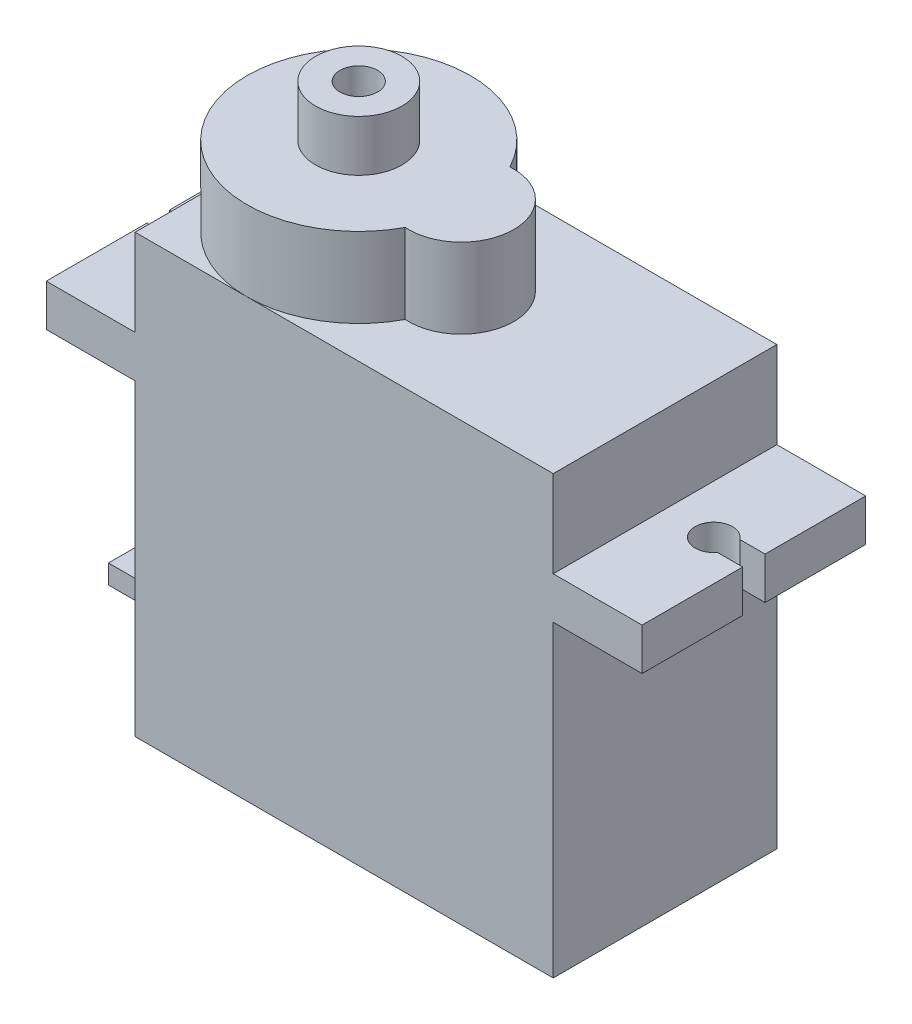
ISO-10303-21;
HEADER;
FILE_DESCRIPTION(('STEP AP214'),'2;1');
FILE_NAME('part.step','',(''),(''),'','','');
FILE_SCHEMA(('AUTOMOTIVE_DESIGN { 1 0 10303 214 1 1 1 1 }'));
ENDSEC;
DATA;
#1=APPLICATION_CONTEXT('core data for automotive mechanical design processes');
#2=APPLICATION_PROTOCOL_DEFINITION('international standard','automotive_design',2000,#1);
#3=PRODUCT_CONTEXT('',#1,'mechanical');
#4=PRODUCT('Part','Part','',(#3));
#5=PRODUCT_RELATED_PRODUCT_CATEGORY('part','',(#4));
#6=PRODUCT_DEFINITION_FORMATION('','',#4);
#7=PRODUCT_DEFINITION_CONTEXT('part definition',#1,'design');
#8=PRODUCT_DEFINITION('design','',#6,#7);
#9=PRODUCT_DEFINITION_SHAPE('','',#8);
#10=(LENGTH_UNIT() NAMED_UNIT(*) SI_UNIT(.MILLI.,.METRE.));
#11=(NAMED_UNIT(*) PLANE_ANGLE_UNIT() SI_UNIT($,.RADIAN.));
#12=(NAMED_UNIT(*) SI_UNIT($,.STERADIAN.) SOLID_ANGLE_UNIT());
#13=UNCERTAINTY_MEASURE_WITH_UNIT(LENGTH_MEASURE(1.E-05),#10,'distance_accuracy_value','');
#14=(GEOMETRIC_REPRESENTATION_CONTEXT(3) GLOBAL_UNCERTAINTY_ASSIGNED_CONTEXT((#13)) GLOBAL_UNIT_ASSIGNED_CONTEXT((#10,
#11,#12)) REPRESENTATION_CONTEXT('',''));
#15=CARTESIAN_POINT('',(0.,0.,0.));
#16=DIRECTION('',(0.,0.,1.));
#17=DIRECTION('',(1.,0.,0.));
#18=AXIS2_PLACEMENT_3D('',#15,#16,#17);
#19=CARTESIAN_POINT('',(0.,23.79,0.));
#20=DIRECTION('',(1.,0.,0.));
#21=DIRECTION('',(0.,0.,-1.));
#22=AXIS2_PLACEMENT_3D('',#19,#20,#21);
#23=PLANE('',#22);
#24=DIRECTION('',(0.,-1.,0.));
#25=VECTOR('',#24,1.);
#26=CARTESIAN_POINT('',(0.,23.79,0.));
#27=LINE('',#26,#25);
#28=CARTESIAN_POINT('',(0.,16.7796,0.));
#29=VERTEX_POINT('',#28);
#30=CARTESIAN_POINT('',(0.,0.,0.));
#31=VERTEX_POINT('',#30);
#32=EDGE_CURVE('E408',#29,#31,#27,.T.);
#33=ORIENTED_EDGE('',*,*,#32,.F.);
#34=DIRECTION('',(0.,0.,-1.));
#35=VECTOR('',#34,1.);
#36=CARTESIAN_POINT('',(0.,16.7796,0.));
#37=LINE('',#36,#35);
#38=CARTESIAN_POINT('',(0.,16.7796,-12.18));
#39=VERTEX_POINT('',#38);
#40=EDGE_CURVE('E370',#29,#39,#37,.T.);
#41=ORIENTED_EDGE('',*,*,#40,.T.);
#42=DIRECTION('',(0.,-1.,0.));
#43=VECTOR('',#42,1.);
#44=CARTESIAN_POINT('',(0.,23.79,-12.18));
#45=LINE('',#44,#43);
#46=CARTESIAN_POINT('',(0.,0.,-12.18));
#47=VERTEX_POINT('',#46);
#48=EDGE_CURVE('E387',#39,#47,#45,.T.);
#49=ORIENTED_EDGE('',*,*,#48,.T.);
#50=DIRECTION('',(0.,0.,1.));
#51=VECTOR('',#50,1.);
#52=CARTESIAN_POINT('',(0.,0.,0.));
#53=LINE('',#52,#51);
#54=EDGE_CURVE('E372',#47,#31,#53,.T.);
#55=ORIENTED_EDGE('',*,*,#54,.T.);
#56=EDGE_LOOP('',(#33,#41,#49,#55));
#57=FACE_BOUND('',#56,.T.);
#58=DIRECTION('',(0.,-1.,0.));
#59=VECTOR('',#58,1.);
#60=CARTESIAN_POINT('',(0.,1.78,-7.5378));
#61=LINE('',#60,#59);
#62=CARTESIAN_POINT('',(0.,2.8214,-7.5378));
#63=VERTEX_POINT('',#62);
#64=CARTESIAN_POINT('',(0.,1.78,-7.5378));
#65=VERTEX_POINT('',#64);
#66=EDGE_CURVE('E228',#63,#65,#61,.T.);
#67=ORIENTED_EDGE('',*,*,#66,.F.);
#68=DIRECTION('',(0.,0.,-1.));
#69=VECTOR('',#68,1.);
#70=CARTESIAN_POINT('',(0.,2.8214,-7.5378));
#71=LINE('',#70,#69);
#72=CARTESIAN_POINT('',(0.,2.8214,-4.6422));
#73=VERTEX_POINT('',#72);
#74=EDGE_CURVE('E240',#73,#63,#71,.T.);
#75=ORIENTED_EDGE('',*,*,#74,.F.);
#76=DIRECTION('',(0.,1.,0.));
#77=VECTOR('',#76,1.);
#78=CARTESIAN_POINT('',(0.,1.78,-4.6422));
#79=LINE('',#78,#77);
#80=CARTESIAN_POINT('',(0.,1.78,-4.6422));
#81=VERTEX_POINT('',#80);
#82=EDGE_CURVE('E57',#81,#73,#79,.T.);
#83=ORIENTED_EDGE('',*,*,#82,.F.);
#84=DIRECTION('',(0.,0.,1.));
#85=VECTOR('',#84,1.);
#86=CARTESIAN_POINT('',(0.,1.78,-7.5378));
#87=LINE('',#86,#85);
#88=EDGE_CURVE('E52',#65,#81,#87,.T.);
#89=ORIENTED_EDGE('',*,*,#88,.F.);
#90=EDGE_LOOP('',(#67,#75,#83,#89));
#91=FACE_BOUND('',#90,.T.);
#92=ADVANCED_FACE('F35',(#57,#91),#23,.F.);
#93=CARTESIAN_POINT('',(0.,23.79,0.));
#94=DIRECTION('',(0.,-1.,0.));
#95=DIRECTION('',(0.,0.,-1.));
#96=AXIS2_PLACEMENT_3D('',#93,#94,#95);
#97=PLANE('',#96);
#98=CARTESIAN_POINT('',(11.6713,23.79,-6.09));
#99=DIRECTION('',(0.,1.,0.));
#100=DIRECTION('',(0.,0.,1.));
#101=AXIS2_PLACEMENT_3D('',#98,#99,#100);
#102=CIRCLE('',#101,2.8575);
#103=CARTESIAN_POINT('',(11.471694537115,23.79,-3.23948006335924));
#104=VERTEX_POINT('',#103);
#105=CARTESIAN_POINT('',(11.471694537115,23.79,-8.94051993664077));
#106=VERTEX_POINT('',#105);
#107=EDGE_CURVE('E265',#104,#106,#102,.T.);
#108=ORIENTED_EDGE('',*,*,#107,.F.);
#109=CARTESIAN_POINT('',(6.09,23.79,-6.09));
#110=DIRECTION('',(0.,1.,0.));
#111=DIRECTION('',(0.,0.,1.));
#112=AXIS2_PLACEMENT_3D('',#109,#110,#111);
#113=CIRCLE('',#112,6.09);
#114=CARTESIAN_POINT('',(6.09,23.79,0.));
#115=VERTEX_POINT('',#114);
#116=EDGE_CURVE('E277',#115,#104,#113,.T.);
#117=ORIENTED_EDGE('',*,*,#116,.F.);
#118=DIRECTION('',(1.,0.,0.));
#119=VECTOR('',#118,1.);
#120=CARTESIAN_POINT('',(0.,23.79,0.));
#121=LINE('',#120,#119);
#122=CARTESIAN_POINT('',(22.7711,23.79,0.));
#123=VERTEX_POINT('',#122);
#124=EDGE_CURVE('E376',#115,#123,#121,.T.);
#125=ORIENTED_EDGE('',*,*,#124,.T.);
#126=DIRECTION('',(0.,0.,-1.));
#127=VECTOR('',#126,1.);
#128=CARTESIAN_POINT('',(22.7711,23.79,0.));
#129=LINE('',#128,#127);
#130=CARTESIAN_POINT('',(22.7711,23.79,-12.18));
#131=VERTEX_POINT('',#130);
#132=EDGE_CURVE('E381',#123,#131,#129,.T.);
#133=ORIENTED_EDGE('',*,*,#132,.T.);
#134=DIRECTION('',(-1.,0.,0.));
#135=VECTOR('',#134,1.);
#136=CARTESIAN_POINT('',(0.,23.79,-12.18));
#137=LINE('',#136,#135);
#138=CARTESIAN_POINT('',(6.09,23.79,-12.18));
#139=VERTEX_POINT('',#138);
#140=EDGE_CURVE('E384',#131,#139,#137,.T.);
#141=ORIENTED_EDGE('',*,*,#140,.T.);
#142=EDGE_CURVE('E45',#106,#139,#113,.T.);
#143=ORIENTED_EDGE('',*,*,#142,.F.);
#144=EDGE_LOOP('',(#108,#117,#125,#133,#141,#143));
#145=FACE_BOUND('',#144,.T.);
#146=ADVANCED_FACE('F462',(#145),#97,.F.);
#147=CARTESIAN_POINT('',(0.,23.79,-6.09));
#148=VERTEX_POINT('',#147);
#149=EDGE_CURVE('E11',#139,#148,#113,.T.);
#150=ORIENTED_EDGE('',*,*,#149,.F.);
#151=CARTESIAN_POINT('',(0.,23.79,-12.18));
#152=VERTEX_POINT('',#151);
#153=EDGE_CURVE('E383',#139,#152,#137,.T.);
#154=ORIENTED_EDGE('',*,*,#153,.T.);
#155=DIRECTION('',(0.,0.,1.));
#156=VECTOR('',#155,1.);
#157=CARTESIAN_POINT('',(0.,23.79,0.));
#158=LINE('',#157,#156);
#159=EDGE_CURVE('E373',#152,#148,#158,.T.);
#160=ORIENTED_EDGE('',*,*,#159,.T.);
#161=EDGE_LOOP('',(#150,#154,#160));
#162=FACE_BOUND('',#161,.T.);
#163=ADVANCED_FACE('F439',(#162),#97,.F.);
#164=CARTESIAN_POINT('',(27.6098,16.7796,0.));
#165=DIRECTION('',(1.,0.,0.));
#166=DIRECTION('',(0.,0.,-1.));
#167=AXIS2_PLACEMENT_3D('',#164,#165,#166);
#168=PLANE('',#167);
#169=DIRECTION('',(0.,1.,0.));
#170=VECTOR('',#169,1.);
#171=CARTESIAN_POINT('',(27.6098,0.,-6.6996));
#172=LINE('',#171,#170);
#173=CARTESIAN_POINT('',(27.6098,16.7796,-6.6996));
#174=VERTEX_POINT('',#173);
#175=CARTESIAN_POINT('',(27.6098,19.0656,-6.6996));
#176=VERTEX_POINT('',#175);
#177=EDGE_CURVE('E295',#174,#176,#172,.T.);
#178=ORIENTED_EDGE('',*,*,#177,.F.);
#179=DIRECTION('',(0.,0.,-1.));
#180=VECTOR('',#179,1.);
#181=CARTESIAN_POINT('',(27.6098,16.7796,0.));
#182=LINE('',#181,#180);
#183=CARTESIAN_POINT('',(27.6098,16.7796,-12.18));
#184=VERTEX_POINT('',#183);
#185=EDGE_CURVE('E327',#174,#184,#182,.T.);
#186=ORIENTED_EDGE('',*,*,#185,.T.);
#187=DIRECTION('',(0.,1.,0.));
#188=VECTOR('',#187,1.);
#189=CARTESIAN_POINT('',(27.6098,16.7796,-12.18));
#190=LINE('',#189,#188);
#191=CARTESIAN_POINT('',(27.6098,19.0656,-12.18));
#192=VERTEX_POINT('',#191);
#193=EDGE_CURVE('E355',#184,#192,#190,.T.);
#194=ORIENTED_EDGE('',*,*,#193,.T.);
#195=DIRECTION('',(0.,0.,-1.));
#196=VECTOR('',#195,1.);
#197=CARTESIAN_POINT('',(27.6098,19.0656,0.));
#198=LINE('',#197,#196);
#199=EDGE_CURVE('E343',#176,#192,#198,.T.);
#200=ORIENTED_EDGE('',*,*,#199,.F.);
#201=EDGE_LOOP('',(#178,#186,#194,#200));
#202=FACE_BOUND('',#201,.T.);
#203=ADVANCED_FACE('F499',(#202),#168,.T.);
#204=CARTESIAN_POINT('',(-4.8387,16.7796,0.));
#205=DIRECTION('',(-1.,0.,0.));
#206=DIRECTION('',(0.,0.,1.));
#207=AXIS2_PLACEMENT_3D('',#204,#205,#206);
#208=PLANE('',#207);
#209=DIRECTION('',(0.,-1.,0.));
#210=VECTOR('',#209,1.);
#211=CARTESIAN_POINT('',(-4.8387,16.7796,-6.6996));
#212=LINE('',#211,#210);
#213=CARTESIAN_POINT('',(-4.8387,19.0656,-6.6996));
#214=VERTEX_POINT('',#213);
#215=CARTESIAN_POINT('',(-4.8387,16.7796,-6.6996));
#216=VERTEX_POINT('',#215);
#217=EDGE_CURVE('E414',#214,#216,#212,.T.);
#218=ORIENTED_EDGE('',*,*,#217,.F.);
#219=DIRECTION('',(0.,0.,1.));
#220=VECTOR('',#219,1.);
#221=CARTESIAN_POINT('',(-4.8387,19.0656,0.));
#222=LINE('',#221,#220);
#223=CARTESIAN_POINT('',(-4.8387,19.0656,-12.18));
#224=VERTEX_POINT('',#223);
#225=EDGE_CURVE('E336',#224,#214,#222,.T.);
#226=ORIENTED_EDGE('',*,*,#225,.F.);
#227=DIRECTION('',(0.,1.,0.));
#228=VECTOR('',#227,1.);
#229=CARTESIAN_POINT('',(-4.8387,16.7796,-12.18));
#230=LINE('',#229,#228);
#231=CARTESIAN_POINT('',(-4.8387,16.7796,-12.18));
#232=VERTEX_POINT('',#231);
#233=EDGE_CURVE('E351',#232,#224,#230,.T.);
#234=ORIENTED_EDGE('',*,*,#233,.F.);
#235=DIRECTION('',(0.,0.,1.));
#236=VECTOR('',#235,1.);
#237=CARTESIAN_POINT('',(-4.8387,16.7796,0.));
#238=LINE('',#237,#236);
#239=EDGE_CURVE('E319',#232,#216,#238,.T.);
#240=ORIENTED_EDGE('',*,*,#239,.T.);
#241=EDGE_LOOP('',(#218,#226,#234,#240));
#242=FACE_BOUND('',#241,.T.);
#243=ADVANCED_FACE('F491',(#242),#208,.T.);
#244=DIRECTION('',(0.,0.,-1.));
#245=VECTOR('',#244,1.);
#246=CARTESIAN_POINT('',(0.,19.0656,0.));
#247=LINE('',#246,#245);
#248=CARTESIAN_POINT('',(0.,19.0656,0.));
#249=VERTEX_POINT('',#248);
#250=CARTESIAN_POINT('',(0.,19.0656,-12.18));
#251=VERTEX_POINT('',#250);
#252=EDGE_CURVE('E365',#249,#251,#247,.T.);
#253=ORIENTED_EDGE('',*,*,#252,.F.);
#254=CARTESIAN_POINT('',(0.,23.79,0.));
#255=VERTEX_POINT('',#254);
#256=EDGE_CURVE('E409',#255,#249,#27,.T.);
#257=ORIENTED_EDGE('',*,*,#256,.F.);
#258=EDGE_CURVE('E377',#148,#255,#158,.T.);
#259=ORIENTED_EDGE('',*,*,#258,.F.);
#260=ORIENTED_EDGE('',*,*,#159,.F.);
#261=EDGE_CURVE('E399',#152,#251,#45,.T.);
#262=ORIENTED_EDGE('',*,*,#261,.T.);
#263=EDGE_LOOP('',(#253,#257,#259,#260,#262));
#264=FACE_BOUND('',#263,.T.);
#265=ADVANCED_FACE('F437',(#264),#23,.F.);
#266=CARTESIAN_POINT('',(22.7711,23.79,0.));
#267=DIRECTION('',(-1.,0.,0.));
#268=DIRECTION('',(0.,0.,1.));
#269=AXIS2_PLACEMENT_3D('',#266,#267,#268);
#270=PLANE('',#269);
#271=DIRECTION('',(0.,0.,1.));
#272=VECTOR('',#271,1.);
#273=CARTESIAN_POINT('',(22.7711,19.0656,0.));
#274=LINE('',#273,#272);
#275=CARTESIAN_POINT('',(22.7711,19.0656,-12.18));
#276=VERTEX_POINT('',#275);
#277=CARTESIAN_POINT('',(22.7711,19.0656,0.));
#278=VERTEX_POINT('',#277);
#279=EDGE_CURVE('E354',#276,#278,#274,.T.);
#280=ORIENTED_EDGE('',*,*,#279,.F.);
#281=DIRECTION('',(0.,-1.,0.));
#282=VECTOR('',#281,1.);
#283=CARTESIAN_POINT('',(22.7711,23.79,-12.18));
#284=LINE('',#283,#282);
#285=EDGE_CURVE('E402',#131,#276,#284,.T.);
#286=ORIENTED_EDGE('',*,*,#285,.F.);
#287=ORIENTED_EDGE('',*,*,#132,.F.);
#288=DIRECTION('',(0.,-1.,0.));
#289=VECTOR('',#288,1.);
#290=CARTESIAN_POINT('',(22.7711,23.79,0.));
#291=LINE('',#290,#289);
#292=EDGE_CURVE('E406',#123,#278,#291,.T.);
#293=ORIENTED_EDGE('',*,*,#292,.T.);
#294=EDGE_LOOP('',(#280,#286,#287,#293));
#295=FACE_BOUND('',#294,.T.);
#296=ADVANCED_FACE('F490',(#295),#270,.F.);
#297=CARTESIAN_POINT('',(0.,23.79,0.));
#298=DIRECTION('',(0.,0.,-1.));
#299=DIRECTION('',(-1.,0.,0.));
#300=AXIS2_PLACEMENT_3D('',#297,#298,#299);
#301=PLANE('',#300);
#302=CARTESIAN_POINT('',(22.7711,16.7796,0.));
#303=VERTEX_POINT('',#302);
#304=CARTESIAN_POINT('',(22.7711,0.,0.));
#305=VERTEX_POINT('',#304);
#306=EDGE_CURVE('E405',#303,#305,#291,.T.);
#307=ORIENTED_EDGE('',*,*,#306,.F.);
#308=DIRECTION('',(1.,0.,0.));
#309=VECTOR('',#308,1.);
#310=CARTESIAN_POINT('',(-4.8387,16.7796,0.));
#311=LINE('',#310,#309);
#312=CARTESIAN_POINT('',(27.6098,16.7796,0.));
#313=VERTEX_POINT('',#312);
#314=EDGE_CURVE('E322',#303,#313,#311,.T.);
#315=ORIENTED_EDGE('',*,*,#314,.T.);
#316=DIRECTION('',(0.,1.,0.));
#317=VECTOR('',#316,1.);
#318=CARTESIAN_POINT('',(27.6098,16.7796,0.));
#319=LINE('',#318,#317);
#320=CARTESIAN_POINT('',(27.6098,19.0656,0.));
#321=VERTEX_POINT('',#320);
#322=EDGE_CURVE('E358',#313,#321,#319,.T.);
#323=ORIENTED_EDGE('',*,*,#322,.T.);
#324=DIRECTION('',(1.,0.,0.));
#325=VECTOR('',#324,1.);
#326=CARTESIAN_POINT('',(-4.8387,19.0656,0.));
#327=LINE('',#326,#325);
#328=EDGE_CURVE('E339',#278,#321,#327,.T.);
#329=ORIENTED_EDGE('',*,*,#328,.F.);
#330=ORIENTED_EDGE('',*,*,#292,.F.);
#331=ORIENTED_EDGE('',*,*,#124,.F.);
#332=EDGE_CURVE('E378',#255,#115,#121,.T.);
#333=ORIENTED_EDGE('',*,*,#332,.F.);
#334=ORIENTED_EDGE('',*,*,#256,.T.);
#335=CARTESIAN_POINT('',(-4.8387,19.0656,0.));
#336=VERTEX_POINT('',#335);
#337=EDGE_CURVE('E340',#336,#249,#327,.T.);
#338=ORIENTED_EDGE('',*,*,#337,.F.);
#339=DIRECTION('',(0.,1.,0.));
#340=VECTOR('',#339,1.);
#341=CARTESIAN_POINT('',(-4.8387,16.7796,0.));
#342=LINE('',#341,#340);
#343=CARTESIAN_POINT('',(-4.8387,16.7796,0.));
#344=VERTEX_POINT('',#343);
#345=EDGE_CURVE('E335',#344,#336,#342,.T.);
#346=ORIENTED_EDGE('',*,*,#345,.F.);
#347=EDGE_CURVE('E324',#344,#29,#311,.T.);
#348=ORIENTED_EDGE('',*,*,#347,.T.);
#349=ORIENTED_EDGE('',*,*,#32,.T.);
#350=DIRECTION('',(1.,0.,0.));
#351=VECTOR('',#350,1.);
#352=CARTESIAN_POINT('',(0.,0.,0.));
#353=LINE('',#352,#351);
#354=EDGE_CURVE('E390',#31,#305,#353,.T.);
#355=ORIENTED_EDGE('',*,*,#354,.T.);
#356=EDGE_LOOP('',(#307,#315,#323,#329,#330,#331,#333,#334,#338,#346,#348,#349,#355));
#357=FACE_BOUND('',#356,.T.);
#358=ADVANCED_FACE('F455',(#357),#301,.F.);
#359=CARTESIAN_POINT('',(22.7711,16.7796,-12.18));
#360=VERTEX_POINT('',#359);
#361=CARTESIAN_POINT('',(22.7711,0.,-12.18));
#362=VERTEX_POINT('',#361);
#363=EDGE_CURVE('E401',#360,#362,#284,.T.);
#364=ORIENTED_EDGE('',*,*,#363,.F.);
#365=DIRECTION('',(0.,0.,1.));
#366=VECTOR('',#365,1.);
#367=CARTESIAN_POINT('',(22.7711,16.7796,0.));
#368=LINE('',#367,#366);
#369=EDGE_CURVE('E368',#360,#303,#368,.T.);
#370=ORIENTED_EDGE('',*,*,#369,.T.);
#371=ORIENTED_EDGE('',*,*,#306,.T.);
#372=DIRECTION('',(0.,0.,-1.));
#373=VECTOR('',#372,1.);
#374=CARTESIAN_POINT('',(22.7711,0.,0.));
#375=LINE('',#374,#373);
#376=EDGE_CURVE('E393',#305,#362,#375,.T.);
#377=ORIENTED_EDGE('',*,*,#376,.T.);
#378=EDGE_LOOP('',(#364,#370,#371,#377));
#379=FACE_BOUND('',#378,.T.);
#380=ADVANCED_FACE('F498',(#379),#270,.F.);
#381=CARTESIAN_POINT('',(0.,23.79,-12.18));
#382=DIRECTION('',(0.,0.,1.));
#383=DIRECTION('',(1.,0.,0.));
#384=AXIS2_PLACEMENT_3D('',#381,#382,#383);
#385=PLANE('',#384);
#386=ORIENTED_EDGE('',*,*,#48,.F.);
#387=DIRECTION('',(-1.,0.,0.));
#388=VECTOR('',#387,1.);
#389=CARTESIAN_POINT('',(-4.8387,16.7796,-12.18));
#390=LINE('',#389,#388);
#391=EDGE_CURVE('E331',#39,#232,#390,.T.);
#392=ORIENTED_EDGE('',*,*,#391,.T.);
#393=ORIENTED_EDGE('',*,*,#233,.T.);
#394=DIRECTION('',(-1.,0.,0.));
#395=VECTOR('',#394,1.);
#396=CARTESIAN_POINT('',(-4.8387,19.0656,-12.18));
#397=LINE('',#396,#395);
#398=EDGE_CURVE('E347',#251,#224,#397,.T.);
#399=ORIENTED_EDGE('',*,*,#398,.F.);
#400=ORIENTED_EDGE('',*,*,#261,.F.);
#401=ORIENTED_EDGE('',*,*,#153,.F.);
#402=ORIENTED_EDGE('',*,*,#140,.F.);
#403=ORIENTED_EDGE('',*,*,#285,.T.);
#404=EDGE_CURVE('E348',#192,#276,#397,.T.);
#405=ORIENTED_EDGE('',*,*,#404,.F.);
#406=ORIENTED_EDGE('',*,*,#193,.F.);
#407=EDGE_CURVE('E332',#184,#360,#390,.T.);
#408=ORIENTED_EDGE('',*,*,#407,.T.);
#409=ORIENTED_EDGE('',*,*,#363,.T.);
#410=DIRECTION('',(-1.,0.,0.));
#411=VECTOR('',#410,1.);
#412=CARTESIAN_POINT('',(0.,0.,-12.18));
#413=LINE('',#412,#411);
#414=EDGE_CURVE('E396',#362,#47,#413,.T.);
#415=ORIENTED_EDGE('',*,*,#414,.T.);
#416=EDGE_LOOP('',(#386,#392,#393,#399,#400,#401,#402,#403,#405,#406,#408,#409,#415));
#417=FACE_BOUND('',#416,.T.);
#418=ADVANCED_FACE('F446',(#417),#385,.F.);
#419=EDGE_CURVE('E43',#148,#115,#113,.T.);
#420=ORIENTED_EDGE('',*,*,#419,.F.);
#421=ORIENTED_EDGE('',*,*,#258,.T.);
#422=ORIENTED_EDGE('',*,*,#332,.T.);
#423=EDGE_LOOP('',(#420,#421,#422));
#424=FACE_BOUND('',#423,.T.);
#425=ADVANCED_FACE('F432',(#424),#97,.F.);
#426=CARTESIAN_POINT('',(0.,0.,0.));
#427=DIRECTION('',(0.,-1.,0.));
#428=DIRECTION('',(0.,0.,-1.));
#429=AXIS2_PLACEMENT_3D('',#426,#427,#428);
#430=PLANE('',#429);
#431=ORIENTED_EDGE('',*,*,#54,.F.);
#432=ORIENTED_EDGE('',*,*,#414,.F.);
#433=ORIENTED_EDGE('',*,*,#376,.F.);
#434=ORIENTED_EDGE('',*,*,#354,.F.);
#435=EDGE_LOOP('',(#431,#432,#433,#434));
#436=FACE_BOUND('',#435,.T.);
#437=ADVANCED_FACE('F536',(#436),#430,.T.);
#438=DIRECTION('',(0.,1.,0.));
#439=VECTOR('',#438,1.);
#440=CARTESIAN_POINT('',(27.6098,0.,-5.48040000000001));
#441=LINE('',#440,#439);
#442=CARTESIAN_POINT('',(27.6098,16.7796,-5.48040000000001));
#443=VERTEX_POINT('',#442);
#444=CARTESIAN_POINT('',(27.6098,19.0656,-5.48040000000001));
#445=VERTEX_POINT('',#444);
#446=EDGE_CURVE('E297',#443,#445,#441,.T.);
#447=ORIENTED_EDGE('',*,*,#446,.T.);
#448=EDGE_CURVE('E344',#321,#445,#198,.T.);
#449=ORIENTED_EDGE('',*,*,#448,.F.);
#450=ORIENTED_EDGE('',*,*,#322,.F.);
#451=EDGE_CURVE('E328',#313,#443,#182,.T.);
#452=ORIENTED_EDGE('',*,*,#451,.T.);
#453=EDGE_LOOP('',(#447,#449,#450,#452));
#454=FACE_BOUND('',#453,.T.);
#455=ADVANCED_FACE('F508',(#454),#168,.T.);
#456=CARTESIAN_POINT('',(0.,19.0656,0.));
#457=DIRECTION('',(0.,-1.,0.));
#458=DIRECTION('',(0.,0.,-1.));
#459=AXIS2_PLACEMENT_3D('',#456,#457,#458);
#460=PLANE('',#459);
#461=CARTESIAN_POINT('',(25.4254,19.0656,-6.09));
#462=DIRECTION('',(0.,1.,0.));
#463=DIRECTION('',(0.,0.,1.));
#464=AXIS2_PLACEMENT_3D('',#461,#462,#463);
#465=CIRCLE('',#464,1.01600000000001);
#466=CARTESIAN_POINT('',(26.2382,19.0656,-6.69960000000001));
#467=VERTEX_POINT('',#466);
#468=CARTESIAN_POINT('',(26.2382,19.0656,-5.4804));
#469=VERTEX_POINT('',#468);
#470=EDGE_CURVE('E283',#467,#469,#465,.T.);
#471=ORIENTED_EDGE('',*,*,#470,.F.);
#472=DIRECTION('',(-1.,0.,0.));
#473=VECTOR('',#472,1.);
#474=CARTESIAN_POINT('',(27.6098,19.0656,-6.6996));
#475=LINE('',#474,#473);
#476=EDGE_CURVE('E288',#176,#467,#475,.T.);
#477=ORIENTED_EDGE('',*,*,#476,.F.);
#478=ORIENTED_EDGE('',*,*,#199,.T.);
#479=ORIENTED_EDGE('',*,*,#404,.T.);
#480=ORIENTED_EDGE('',*,*,#279,.T.);
#481=ORIENTED_EDGE('',*,*,#328,.T.);
#482=ORIENTED_EDGE('',*,*,#448,.T.);
#483=DIRECTION('',(1.,0.,0.));
#484=VECTOR('',#483,1.);
#485=CARTESIAN_POINT('',(26.2382,19.0656,-5.4804));
#486=LINE('',#485,#484);
#487=EDGE_CURVE('E286',#469,#445,#486,.T.);
#488=ORIENTED_EDGE('',*,*,#487,.F.);
#489=EDGE_LOOP('',(#471,#477,#478,#479,#480,#481,#482,#488));
#490=FACE_BOUND('',#489,.T.);
#491=ADVANCED_FACE('F522',(#490),#460,.F.);
#492=CARTESIAN_POINT('',(0.,16.7796,0.));
#493=DIRECTION('',(0.,-1.,0.));
#494=DIRECTION('',(0.,0.,-1.));
#495=AXIS2_PLACEMENT_3D('',#492,#493,#494);
#496=PLANE('',#495);
#497=DIRECTION('',(1.,0.,0.));
#498=VECTOR('',#497,1.);
#499=CARTESIAN_POINT('',(0.,16.7796,-6.69960000000021));
#500=LINE('',#499,#498);
#501=CARTESIAN_POINT('',(26.2382,16.7796,-6.69960000000001));
#502=VERTEX_POINT('',#501);
#503=EDGE_CURVE('E38',#502,#174,#500,.T.);
#504=ORIENTED_EDGE('',*,*,#503,.F.);
#505=CARTESIAN_POINT('',(25.4254,16.7796,-6.09));
#506=DIRECTION('',(0.,-1.,0.));
#507=DIRECTION('',(0.,0.,-1.));
#508=AXIS2_PLACEMENT_3D('',#505,#506,#507);
#509=CIRCLE('',#508,1.01600000000001);
#510=CARTESIAN_POINT('',(26.2382,16.7796,-5.4804));
#511=VERTEX_POINT('',#510);
#512=EDGE_CURVE('E417',#511,#502,#509,.T.);
#513=ORIENTED_EDGE('',*,*,#512,.F.);
#514=DIRECTION('',(-1.,0.,0.));
#515=VECTOR('',#514,1.);
#516=CARTESIAN_POINT('',(0.,16.7796,-5.48039999999979));
#517=LINE('',#516,#515);
#518=EDGE_CURVE('E416',#443,#511,#517,.T.);
#519=ORIENTED_EDGE('',*,*,#518,.F.);
#520=ORIENTED_EDGE('',*,*,#451,.F.);
#521=ORIENTED_EDGE('',*,*,#314,.F.);
#522=ORIENTED_EDGE('',*,*,#369,.F.);
#523=ORIENTED_EDGE('',*,*,#407,.F.);
#524=ORIENTED_EDGE('',*,*,#185,.F.);
#525=EDGE_LOOP('',(#504,#513,#519,#520,#521,#522,#523,#524));
#526=FACE_BOUND('',#525,.T.);
#527=ADVANCED_FACE('F546',(#526),#496,.T.);
#528=DIRECTION('',(1.,0.,0.));
#529=VECTOR('',#528,1.);
#530=CARTESIAN_POINT('',(0.,16.7796,-6.6996));
#531=LINE('',#530,#529);
#532=CARTESIAN_POINT('',(-3.4671,16.7796,-6.6996));
#533=VERTEX_POINT('',#532);
#534=EDGE_CURVE('E314',#216,#533,#531,.T.);
#535=ORIENTED_EDGE('',*,*,#534,.F.);
#536=ORIENTED_EDGE('',*,*,#239,.F.);
#537=ORIENTED_EDGE('',*,*,#391,.F.);
#538=ORIENTED_EDGE('',*,*,#40,.F.);
#539=ORIENTED_EDGE('',*,*,#347,.F.);
#540=CARTESIAN_POINT('',(-4.8387,16.7796,-5.4804));
#541=VERTEX_POINT('',#540);
#542=EDGE_CURVE('E323',#541,#344,#238,.T.);
#543=ORIENTED_EDGE('',*,*,#542,.F.);
#544=DIRECTION('',(-1.,0.,0.));
#545=VECTOR('',#544,1.);
#546=CARTESIAN_POINT('',(0.,16.7796,-5.4804));
#547=LINE('',#546,#545);
#548=CARTESIAN_POINT('',(-3.4671,16.7796,-5.4804));
#549=VERTEX_POINT('',#548);
#550=EDGE_CURVE('E311',#549,#541,#547,.T.);
#551=ORIENTED_EDGE('',*,*,#550,.F.);
#552=CARTESIAN_POINT('',(-2.6543,16.7796,-6.09));
#553=DIRECTION('',(0.,-1.,0.));
#554=DIRECTION('',(0.,0.,-1.));
#555=AXIS2_PLACEMENT_3D('',#552,#553,#554);
#556=CIRCLE('',#555,1.016);
#557=EDGE_CURVE('E316',#533,#549,#556,.T.);
#558=ORIENTED_EDGE('',*,*,#557,.F.);
#559=EDGE_LOOP('',(#535,#536,#537,#538,#539,#543,#551,#558));
#560=FACE_BOUND('',#559,.T.);
#561=ADVANCED_FACE('F520',(#560),#496,.T.);
#562=ORIENTED_EDGE('',*,*,#225,.T.);
#563=DIRECTION('',(-1.,0.,0.));
#564=VECTOR('',#563,1.);
#565=CARTESIAN_POINT('',(-4.8387,19.0656,-6.6996));
#566=LINE('',#565,#564);
#567=CARTESIAN_POINT('',(-3.4671,19.0656,-6.6996));
#568=VERTEX_POINT('',#567);
#569=EDGE_CURVE('E306',#568,#214,#566,.T.);
#570=ORIENTED_EDGE('',*,*,#569,.F.);
#571=CARTESIAN_POINT('',(-2.6543,19.0656,-6.09));
#572=DIRECTION('',(0.,1.,0.));
#573=DIRECTION('',(0.,0.,-1.));
#574=AXIS2_PLACEMENT_3D('',#571,#572,#573);
#575=CIRCLE('',#574,1.016);
#576=CARTESIAN_POINT('',(-3.4671,19.0656,-5.4804));
#577=VERTEX_POINT('',#576);
#578=EDGE_CURVE('E303',#577,#568,#575,.T.);
#579=ORIENTED_EDGE('',*,*,#578,.F.);
#580=DIRECTION('',(1.,0.,0.));
#581=VECTOR('',#580,1.);
#582=CARTESIAN_POINT('',(-3.4671,19.0656,-5.4804));
#583=LINE('',#582,#581);
#584=CARTESIAN_POINT('',(-4.8387,19.0656,-5.4804));
#585=VERTEX_POINT('',#584);
#586=EDGE_CURVE('E294',#585,#577,#583,.T.);
#587=ORIENTED_EDGE('',*,*,#586,.F.);
#588=EDGE_CURVE('E318',#585,#336,#222,.T.);
#589=ORIENTED_EDGE('',*,*,#588,.T.);
#590=ORIENTED_EDGE('',*,*,#337,.T.);
#591=ORIENTED_EDGE('',*,*,#252,.T.);
#592=ORIENTED_EDGE('',*,*,#398,.T.);
#593=EDGE_LOOP('',(#562,#570,#579,#587,#589,#590,#591,#592));
#594=FACE_BOUND('',#593,.T.);
#595=ADVANCED_FACE('F448',(#594),#460,.F.);
#596=DIRECTION('',(0.,1.,0.));
#597=VECTOR('',#596,1.);
#598=CARTESIAN_POINT('',(-4.8387,16.7796,-5.4804));
#599=LINE('',#598,#597);
#600=EDGE_CURVE('E412',#541,#585,#599,.T.);
#601=ORIENTED_EDGE('',*,*,#600,.F.);
#602=ORIENTED_EDGE('',*,*,#542,.T.);
#603=ORIENTED_EDGE('',*,*,#345,.T.);
#604=ORIENTED_EDGE('',*,*,#588,.F.);
#605=EDGE_LOOP('',(#601,#602,#603,#604));
#606=FACE_BOUND('',#605,.T.);
#607=ADVANCED_FACE('F502',(#606),#208,.T.);
#608=CARTESIAN_POINT('',(-4.8387,0.,-6.6996));
#609=DIRECTION('',(0.,0.,-1.));
#610=DIRECTION('',(-1.,0.,0.));
#611=AXIS2_PLACEMENT_3D('',#608,#609,#610);
#612=PLANE('',#611);
#613=ORIENTED_EDGE('',*,*,#534,.T.);
#614=DIRECTION('',(0.,1.,0.));
#615=VECTOR('',#614,1.);
#616=CARTESIAN_POINT('',(-3.4671,0.,-6.6996));
#617=LINE('',#616,#615);
#618=EDGE_CURVE('E309',#533,#568,#617,.T.);
#619=ORIENTED_EDGE('',*,*,#618,.T.);
#620=ORIENTED_EDGE('',*,*,#569,.T.);
#621=ORIENTED_EDGE('',*,*,#217,.T.);
#622=EDGE_LOOP('',(#613,#619,#620,#621));
#623=FACE_BOUND('',#622,.T.);
#624=ADVANCED_FACE('F511',(#623),#612,.F.);
#625=CARTESIAN_POINT('',(-2.6543,0.,-6.09));
#626=DIRECTION('',(0.,1.,0.));
#627=DIRECTION('',(0.,0.,1.));
#628=AXIS2_PLACEMENT_3D('',#625,#626,#627);
#629=CYLINDRICAL_SURFACE('',#628,1.016);
#630=ORIENTED_EDGE('',*,*,#557,.T.);
#631=DIRECTION('',(0.,1.,0.));
#632=VECTOR('',#631,1.);
#633=CARTESIAN_POINT('',(-3.4671,0.,-5.4804));
#634=LINE('',#633,#632);
#635=EDGE_CURVE('E308',#549,#577,#634,.T.);
#636=ORIENTED_EDGE('',*,*,#635,.T.);
#637=ORIENTED_EDGE('',*,*,#578,.T.);
#638=ORIENTED_EDGE('',*,*,#618,.F.);
#639=EDGE_LOOP('',(#630,#636,#637,#638));
#640=FACE_BOUND('',#639,.T.);
#641=ADVANCED_FACE('F517',(#640),#629,.F.);
#642=CARTESIAN_POINT('',(-3.4671,0.,-5.4804));
#643=DIRECTION('',(0.,0.,1.));
#644=DIRECTION('',(1.,0.,0.));
#645=AXIS2_PLACEMENT_3D('',#642,#643,#644);
#646=PLANE('',#645);
#647=ORIENTED_EDGE('',*,*,#550,.T.);
#648=ORIENTED_EDGE('',*,*,#600,.T.);
#649=ORIENTED_EDGE('',*,*,#586,.T.);
#650=ORIENTED_EDGE('',*,*,#635,.F.);
#651=EDGE_LOOP('',(#647,#648,#649,#650));
#652=FACE_BOUND('',#651,.T.);
#653=ADVANCED_FACE('F571',(#652),#646,.F.);
#654=CARTESIAN_POINT('',(25.4254,0.,-6.09));
#655=DIRECTION('',(0.,1.,0.));
#656=DIRECTION('',(0.,0.,1.));
#657=AXIS2_PLACEMENT_3D('',#654,#655,#656);
#658=CYLINDRICAL_SURFACE('',#657,1.01600000000001);
#659=ORIENTED_EDGE('',*,*,#512,.T.);
#660=DIRECTION('',(0.,1.,0.));
#661=VECTOR('',#660,1.);
#662=CARTESIAN_POINT('',(26.2382,0.,-6.69960000000001));
#663=LINE('',#662,#661);
#664=EDGE_CURVE('E292',#502,#467,#663,.T.);
#665=ORIENTED_EDGE('',*,*,#664,.T.);
#666=ORIENTED_EDGE('',*,*,#470,.T.);
#667=DIRECTION('',(0.,1.,0.));
#668=VECTOR('',#667,1.);
#669=CARTESIAN_POINT('',(26.2382,0.,-5.4804));
#670=LINE('',#669,#668);
#671=EDGE_CURVE('E291',#511,#469,#670,.T.);
#672=ORIENTED_EDGE('',*,*,#671,.F.);
#673=EDGE_LOOP('',(#659,#665,#666,#672));
#674=FACE_BOUND('',#673,.T.);
#675=ADVANCED_FACE('F558',(#674),#658,.F.);
#676=CARTESIAN_POINT('',(27.6098,0.,-6.6996));
#677=DIRECTION('',(0.,0.,-1.));
#678=DIRECTION('',(-1.,0.,0.));
#679=AXIS2_PLACEMENT_3D('',#676,#677,#678);
#680=PLANE('',#679);
#681=ORIENTED_EDGE('',*,*,#503,.T.);
#682=ORIENTED_EDGE('',*,*,#177,.T.);
#683=ORIENTED_EDGE('',*,*,#476,.T.);
#684=ORIENTED_EDGE('',*,*,#664,.F.);
#685=EDGE_LOOP('',(#681,#682,#683,#684));
#686=FACE_BOUND('',#685,.T.);
#687=ADVANCED_FACE('F557',(#686),#680,.F.);
#688=CARTESIAN_POINT('',(26.2382,0.,-5.4804));
#689=DIRECTION('',(0.,0.,1.));
#690=DIRECTION('',(1.,0.,0.));
#691=AXIS2_PLACEMENT_3D('',#688,#689,#690);
#692=PLANE('',#691);
#693=ORIENTED_EDGE('',*,*,#518,.T.);
#694=ORIENTED_EDGE('',*,*,#671,.T.);
#695=ORIENTED_EDGE('',*,*,#487,.T.);
#696=ORIENTED_EDGE('',*,*,#446,.F.);
#697=EDGE_LOOP('',(#693,#694,#695,#696));
#698=FACE_BOUND('',#697,.T.);
#699=ADVANCED_FACE('F560',(#698),#692,.F.);
#700=CARTESIAN_POINT('',(11.6713,28.1334,-6.09));
#701=DIRECTION('',(0.,-1.,0.));
#702=DIRECTION('',(0.,0.,-1.));
#703=AXIS2_PLACEMENT_3D('',#700,#701,#702);
#704=CYLINDRICAL_SURFACE('',#703,2.8575);
#705=ORIENTED_EDGE('',*,*,#107,.T.);
#706=DIRECTION('',(0.,-1.,0.));
#707=VECTOR('',#706,1.);
#708=CARTESIAN_POINT('',(11.471694537115,28.1334,-8.94051993664077));
#709=LINE('',#708,#707);
#710=CARTESIAN_POINT('',(11.471694537115,28.1334,-8.94051993664077));
#711=VERTEX_POINT('',#710);
#712=EDGE_CURVE('E280',#711,#106,#709,.T.);
#713=ORIENTED_EDGE('',*,*,#712,.F.);
#714=CARTESIAN_POINT('',(11.6713,28.1334,-6.09));
#715=DIRECTION('',(0.,1.,0.));
#716=DIRECTION('',(0.,0.,1.));
#717=AXIS2_PLACEMENT_3D('',#714,#715,#716);
#718=CIRCLE('',#717,2.8575);
#719=CARTESIAN_POINT('',(11.471694537115,28.1334,-3.23948006335924));
#720=VERTEX_POINT('',#719);
#721=EDGE_CURVE('E268',#720,#711,#718,.T.);
#722=ORIENTED_EDGE('',*,*,#721,.F.);
#723=DIRECTION('',(0.,-1.,0.));
#724=VECTOR('',#723,1.);
#725=CARTESIAN_POINT('',(11.471694537115,28.1334,-3.23948006335924));
#726=LINE('',#725,#724);
#727=EDGE_CURVE('E273',#720,#104,#726,.T.);
#728=ORIENTED_EDGE('',*,*,#727,.T.);
#729=EDGE_LOOP('',(#705,#713,#722,#728));
#730=FACE_BOUND('',#729,.T.);
#731=ADVANCED_FACE('F466',(#730),#704,.T.);
#732=CARTESIAN_POINT('',(6.09,28.1334,-6.09));
#733=DIRECTION('',(0.,-1.,0.));
#734=DIRECTION('',(0.,0.,-1.));
#735=AXIS2_PLACEMENT_3D('',#732,#733,#734);
#736=CYLINDRICAL_SURFACE('',#735,6.09);
#737=ORIENTED_EDGE('',*,*,#142,.T.);
#738=ORIENTED_EDGE('',*,*,#149,.T.);
#739=ORIENTED_EDGE('',*,*,#419,.T.);
#740=ORIENTED_EDGE('',*,*,#116,.T.);
#741=ORIENTED_EDGE('',*,*,#727,.F.);
#742=CARTESIAN_POINT('',(6.09,28.1334,-6.09));
#743=DIRECTION('',(0.,1.,0.));
#744=DIRECTION('',(0.,0.,1.));
#745=AXIS2_PLACEMENT_3D('',#742,#743,#744);
#746=CIRCLE('',#745,6.09);
#747=EDGE_CURVE('E271',#711,#720,#746,.T.);
#748=ORIENTED_EDGE('',*,*,#747,.F.);
#749=ORIENTED_EDGE('',*,*,#712,.T.);
#750=EDGE_LOOP('',(#737,#738,#739,#740,#741,#748,#749));
#751=FACE_BOUND('',#750,.T.);
#752=ADVANCED_FACE('F429',(#751),#736,.T.);
#753=CARTESIAN_POINT('',(8.88065,28.1334,-6.09));
#754=DIRECTION('',(0.,1.,0.));
#755=DIRECTION('',(0.,0.,1.));
#756=AXIS2_PLACEMENT_3D('',#753,#754,#755);
#757=PLANE('',#756);
#758=CARTESIAN_POINT('',(6.09,28.1334,-6.09));
#759=DIRECTION('',(0.,1.,0.));
#760=DIRECTION('',(0.,0.,1.));
#761=AXIS2_PLACEMENT_3D('',#758,#759,#760);
#762=CIRCLE('',#761,2.3495);
#763=CARTESIAN_POINT('',(6.09,28.1334,-8.4395));
#764=VERTEX_POINT('',#763);
#765=EDGE_CURVE('E261',#764,#764,#762,.T.);
#766=ORIENTED_EDGE('',*,*,#765,.F.);
#767=EDGE_LOOP('',(#766));
#768=FACE_BOUND('',#767,.T.);
#769=ORIENTED_EDGE('',*,*,#721,.T.);
#770=ORIENTED_EDGE('',*,*,#747,.T.);
#771=EDGE_LOOP('',(#769,#770));
#772=FACE_BOUND('',#771,.T.);
#773=ADVANCED_FACE('F469',(#768,#772),#757,.T.);
#774=CARTESIAN_POINT('',(6.09,30.9147,-6.09));
#775=DIRECTION('',(0.,-1.,0.));
#776=DIRECTION('',(0.,0.,-1.));
#777=AXIS2_PLACEMENT_3D('',#774,#775,#776);
#778=CYLINDRICAL_SURFACE('',#777,2.3495);
#779=CARTESIAN_POINT('',(6.09,30.9147,-6.09));
#780=DIRECTION('',(0.,1.,0.));
#781=DIRECTION('',(0.,0.,1.));
#782=AXIS2_PLACEMENT_3D('',#779,#780,#781);
#783=CIRCLE('',#782,2.3495);
#784=CARTESIAN_POINT('',(6.09,30.9147,-8.4395));
#785=VERTEX_POINT('',#784);
#786=EDGE_CURVE('E262',#785,#785,#783,.T.);
#787=CARTESIAN_POINT('',(6.09,30.9147,-8.4395));
#788=CARTESIAN_POINT('',(6.09,30.885728125,-8.4395));
#789=CARTESIAN_POINT('',(6.09,30.85675625,-8.4395));
#790=CARTESIAN_POINT('',(6.09,30.7988125,-8.4395));
#791=CARTESIAN_POINT('',(6.09,30.769840625,-8.4395));
#792=CARTESIAN_POINT('',(6.09,30.711896875,-8.4395));
#793=CARTESIAN_POINT('',(6.09,30.682925,-8.4395));
#794=CARTESIAN_POINT('',(6.09,30.62498125,-8.4395));
#795=CARTESIAN_POINT('',(6.09,30.596009375,-8.4395));
#796=CARTESIAN_POINT('',(6.09,30.538065625,-8.4395));
#797=CARTESIAN_POINT('',(6.09,30.50909375,-8.4395));
#798=CARTESIAN_POINT('',(6.09,30.45115,-8.4395));
#799=CARTESIAN_POINT('',(6.09,30.422178125,-8.4395));
#800=CARTESIAN_POINT('',(6.09,30.364234375,-8.4395));
#801=CARTESIAN_POINT('',(6.09,30.3352625,-8.4395));
#802=CARTESIAN_POINT('',(6.09,30.27731875,-8.4395));
#803=CARTESIAN_POINT('',(6.09,30.248346875,-8.4395));
#804=CARTESIAN_POINT('',(6.09,30.190403125,-8.4395));
#805=CARTESIAN_POINT('',(6.09,30.16143125,-8.4395));
#806=CARTESIAN_POINT('',(6.09,30.1034875,-8.4395));
#807=CARTESIAN_POINT('',(6.09,30.074515625,-8.4395));
#808=CARTESIAN_POINT('',(6.09,30.016571875,-8.4395));
#809=CARTESIAN_POINT('',(6.09,29.9876,-8.4395));
#810=CARTESIAN_POINT('',(6.09,29.92965625,-8.4395));
#811=CARTESIAN_POINT('',(6.09,29.900684375,-8.4395));
#812=CARTESIAN_POINT('',(6.09,29.842740625,-8.4395));
#813=CARTESIAN_POINT('',(6.09,29.81376875,-8.4395));
#814=CARTESIAN_POINT('',(6.09,29.755825,-8.4395));
#815=CARTESIAN_POINT('',(6.09,29.726853125,-8.4395));
#816=CARTESIAN_POINT('',(6.09,29.668909375,-8.4395));
#817=CARTESIAN_POINT('',(6.09,29.6399375,-8.4395));
#818=CARTESIAN_POINT('',(6.09,29.58199375,-8.4395));
#819=CARTESIAN_POINT('',(6.09,29.553021875,-8.4395));
#820=CARTESIAN_POINT('',(6.09,29.495078125,-8.4395));
#821=CARTESIAN_POINT('',(6.09,29.46610625,-8.4395));
#822=CARTESIAN_POINT('',(6.09,29.4081625,-8.4395));
#823=CARTESIAN_POINT('',(6.09,29.379190625,-8.4395));
#824=CARTESIAN_POINT('',(6.09,29.321246875,-8.4395));
#825=CARTESIAN_POINT('',(6.09,29.292275,-8.4395));
#826=CARTESIAN_POINT('',(6.09,29.23433125,-8.4395));
#827=CARTESIAN_POINT('',(6.09,29.205359375,-8.4395));
#828=CARTESIAN_POINT('',(6.09,29.147415625,-8.4395));
#829=CARTESIAN_POINT('',(6.09,29.11844375,-8.4395));
#830=CARTESIAN_POINT('',(6.09,29.0605,-8.4395));
#831=CARTESIAN_POINT('',(6.09,29.031528125,-8.4395));
#832=CARTESIAN_POINT('',(6.09,28.973584375,-8.4395));
#833=CARTESIAN_POINT('',(6.09,28.9446125,-8.4395));
#834=CARTESIAN_POINT('',(6.09,28.88666875,-8.4395));
#835=CARTESIAN_POINT('',(6.09,28.857696875,-8.4395));
#836=CARTESIAN_POINT('',(6.09,28.799753125,-8.4395));
#837=CARTESIAN_POINT('',(6.09,28.77078125,-8.4395));
#838=CARTESIAN_POINT('',(6.09,28.7128375,-8.4395));
#839=CARTESIAN_POINT('',(6.09,28.683865625,-8.4395));
#840=CARTESIAN_POINT('',(6.09,28.625921875,-8.4395));
#841=CARTESIAN_POINT('',(6.09,28.59695,-8.4395));
#842=CARTESIAN_POINT('',(6.09,28.53900625,-8.4395));
#843=CARTESIAN_POINT('',(6.09,28.510034375,-8.4395));
#844=CARTESIAN_POINT('',(6.09,28.452090625,-8.4395));
#845=CARTESIAN_POINT('',(6.09,28.42311875,-8.4395));
#846=CARTESIAN_POINT('',(6.09,28.365175,-8.4395));
#847=CARTESIAN_POINT('',(6.09,28.336203125,-8.4395));
#848=CARTESIAN_POINT('',(6.09,28.278259375,-8.4395));
#849=CARTESIAN_POINT('',(6.09,28.2492875,-8.4395));
#850=CARTESIAN_POINT('',(6.09,28.19134375,-8.4395));
#851=CARTESIAN_POINT('',(6.09,28.162371875,-8.4395));
#852=CARTESIAN_POINT('',(6.09,28.1334,-8.4395));
#853=B_SPLINE_CURVE_WITH_KNOTS('',3,(#787,#788,#789,#790,#791,#792,#793,#794,#795,#796,#797,
#798,#799,#800,#801,#802,#803,#804,#805,#806,#807,#808,#809,#810,#811,#812,#813,#814,#815,#816,
#817,#818,#819,#820,#821,#822,#823,#824,#825,#826,#827,#828,#829,#830,#831,#832,#833,#834,#835,
#836,#837,#838,#839,#840,#841,#842,#843,#844,#845,#846,#847,#848,#849,#850,#851,#852),
.UNSPECIFIED.,.F.,.F.,(4,2,2,2,2,2,2,2,2,2,2,2,2,2,2,2,2,2,2,2,2,2,2,2,2,2,2,2,2,2,2,2,4),(0.,
0.086915625000003,0.173831250000003,0.260746875000002,0.347662500000002,0.434578125000001,
0.521493750000001,0.608409375000001,0.695325,0.782240625000003,0.869156250000003,
0.956071875000002,1.0429875,1.129903125,1.21681875,1.303734375,1.39065,1.477565625,1.56448125,
1.651396875,1.7383125,1.825228125,1.91214375,1.999059375,2.085975,2.172890625,2.25980625,
2.346721875,2.4336375,2.520553125,2.60746875,2.694384375,2.7813),.UNSPECIFIED.);
#854=EDGE_CURVE('BSEAM471',#785,#764,#853,.T.);
#855=ORIENTED_EDGE('',*,*,#786,.F.);
#856=ORIENTED_EDGE('',*,*,#765,.T.);
#857=ORIENTED_EDGE('',*,*,#854,.T.);
#858=ORIENTED_EDGE('',*,*,#854,.F.);
#859=EDGE_LOOP('',(#855,#857,#856,#858));
#860=FACE_BOUND('',#859,.T.);
#861=ADVANCED_FACE('F471',(#860),#778,.T.);
#862=CARTESIAN_POINT('',(6.09,30.9147,-6.09));
#863=DIRECTION('',(0.,1.,0.));
#864=DIRECTION('',(0.,0.,1.));
#865=AXIS2_PLACEMENT_3D('',#862,#863,#864);
#866=PLANE('',#865);
#867=CARTESIAN_POINT('',(6.09,30.9147,-6.09));
#868=DIRECTION('',(0.,1.,0.));
#869=DIRECTION('',(0.,0.,1.));
#870=AXIS2_PLACEMENT_3D('',#867,#868,#869);
#871=CIRCLE('',#870,1.02499999999999);
#872=CARTESIAN_POINT('',(6.09,30.9147,-5.06500000000001));
#873=VERTEX_POINT('',#872);
#874=EDGE_CURVE('E229',#873,#873,#871,.T.);
#875=ORIENTED_EDGE('',*,*,#874,.F.);
#876=EDGE_LOOP('',(#875));
#877=FACE_BOUND('',#876,.T.);
#878=ORIENTED_EDGE('',*,*,#786,.T.);
#879=EDGE_LOOP('',(#878));
#880=FACE_BOUND('',#879,.T.);
#881=ADVANCED_FACE('F478',(#877,#880),#866,.T.);
#882=CARTESIAN_POINT('',(-6.096,1.78,-7.5378));
#883=DIRECTION('',(0.,0.,1.));
#884=DIRECTION('',(1.,0.,0.));
#885=AXIS2_PLACEMENT_3D('',#882,#883,#884);
#886=PLANE('',#885);
#887=ORIENTED_EDGE('',*,*,#66,.T.);
#888=DIRECTION('',(1.,0.,0.));
#889=VECTOR('',#888,1.);
#890=CARTESIAN_POINT('',(-6.096,1.78,-7.5378));
#891=LINE('',#890,#889);
#892=CARTESIAN_POINT('',(-6.096,1.78,-7.5378));
#893=VERTEX_POINT('',#892);
#894=EDGE_CURVE('E259',#893,#65,#891,.T.);
#895=ORIENTED_EDGE('',*,*,#894,.F.);
#896=DIRECTION('',(0.,-1.,0.));
#897=VECTOR('',#896,1.);
#898=CARTESIAN_POINT('',(-6.096,1.78,-7.5378));
#899=LINE('',#898,#897);
#900=CARTESIAN_POINT('',(-6.096,2.8214,-7.5378));
#901=VERTEX_POINT('',#900);
#902=EDGE_CURVE('E236',#901,#893,#899,.T.);
#903=ORIENTED_EDGE('',*,*,#902,.F.);
#904=DIRECTION('',(1.,0.,0.));
#905=VECTOR('',#904,1.);
#906=CARTESIAN_POINT('',(-6.096,2.8214,-7.5378));
#907=LINE('',#906,#905);
#908=EDGE_CURVE('E245',#901,#63,#907,.T.);
#909=ORIENTED_EDGE('',*,*,#908,.T.);
#910=EDGE_LOOP('',(#887,#895,#903,#909));
#911=FACE_BOUND('',#910,.T.);
#912=ADVANCED_FACE('F646',(#911),#886,.F.);
#913=CARTESIAN_POINT('',(-6.096,1.78,-7.5378));
#914=DIRECTION('',(0.,1.,0.));
#915=DIRECTION('',(0.,0.,1.));
#916=AXIS2_PLACEMENT_3D('',#913,#914,#915);
#917=PLANE('',#916);
#918=ORIENTED_EDGE('',*,*,#88,.T.);
#919=DIRECTION('',(1.,0.,0.));
#920=VECTOR('',#919,1.);
#921=CARTESIAN_POINT('',(-6.096,1.78,-4.6422));
#922=LINE('',#921,#920);
#923=CARTESIAN_POINT('',(-6.096,1.78,-4.6422));
#924=VERTEX_POINT('',#923);
#925=EDGE_CURVE('E256',#924,#81,#922,.T.);
#926=ORIENTED_EDGE('',*,*,#925,.F.);
#927=DIRECTION('',(0.,0.,1.));
#928=VECTOR('',#927,1.);
#929=CARTESIAN_POINT('',(-6.096,1.78,-7.5378));
#930=LINE('',#929,#928);
#931=EDGE_CURVE('E239',#893,#924,#930,.T.);
#932=ORIENTED_EDGE('',*,*,#931,.F.);
#933=ORIENTED_EDGE('',*,*,#894,.T.);
#934=EDGE_LOOP('',(#918,#926,#932,#933));
#935=FACE_BOUND('',#934,.T.);
#936=ADVANCED_FACE('F650',(#935),#917,.F.);
#937=CARTESIAN_POINT('',(-6.096,1.78,-4.6422));
#938=DIRECTION('',(0.,0.,-1.));
#939=DIRECTION('',(0.,1.,0.));
#940=AXIS2_PLACEMENT_3D('',#937,#938,#939);
#941=PLANE('',#940);
#942=ORIENTED_EDGE('',*,*,#82,.T.);
#943=DIRECTION('',(1.,0.,0.));
#944=VECTOR('',#943,1.);
#945=CARTESIAN_POINT('',(-6.096,2.8214,-4.6422));
#946=LINE('',#945,#944);
#947=CARTESIAN_POINT('',(-6.096,2.8214,-4.6422));
#948=VERTEX_POINT('',#947);
#949=EDGE_CURVE('E253',#948,#73,#946,.T.);
#950=ORIENTED_EDGE('',*,*,#949,.F.);
#951=DIRECTION('',(0.,1.,0.));
#952=VECTOR('',#951,1.);
#953=CARTESIAN_POINT('',(-6.096,1.78,-4.6422));
#954=LINE('',#953,#952);
#955=EDGE_CURVE('E242',#924,#948,#954,.T.);
#956=ORIENTED_EDGE('',*,*,#955,.F.);
#957=ORIENTED_EDGE('',*,*,#925,.T.);
#958=EDGE_LOOP('',(#942,#950,#956,#957));
#959=FACE_BOUND('',#958,.T.);
#960=ADVANCED_FACE('F660',(#959),#941,.F.);
#961=CARTESIAN_POINT('',(-6.096,2.8214,-7.5378));
#962=DIRECTION('',(0.,-1.,0.));
#963=DIRECTION('',(0.,0.,-1.));
#964=AXIS2_PLACEMENT_3D('',#961,#962,#963);
#965=PLANE('',#964);
#966=ORIENTED_EDGE('',*,*,#74,.T.);
#967=ORIENTED_EDGE('',*,*,#908,.F.);
#968=DIRECTION('',(0.,0.,-1.));
#969=VECTOR('',#968,1.);
#970=CARTESIAN_POINT('',(-6.096,2.8214,-7.5378));
#971=LINE('',#970,#969);
#972=EDGE_CURVE('E244',#948,#901,#971,.T.);
#973=ORIENTED_EDGE('',*,*,#972,.F.);
#974=ORIENTED_EDGE('',*,*,#949,.T.);
#975=EDGE_LOOP('',(#966,#967,#973,#974));
#976=FACE_BOUND('',#975,.T.);
#977=ADVANCED_FACE('F670',(#976),#965,.F.);
#978=CARTESIAN_POINT('',(-6.096,0.,0.));
#979=DIRECTION('',(1.,0.,0.));
#980=DIRECTION('',(0.,0.,-1.));
#981=AXIS2_PLACEMENT_3D('',#978,#979,#980);
#982=PLANE('',#981);
#983=ORIENTED_EDGE('',*,*,#902,.T.);
#984=ORIENTED_EDGE('',*,*,#931,.T.);
#985=ORIENTED_EDGE('',*,*,#955,.T.);
#986=ORIENTED_EDGE('',*,*,#972,.T.);
#987=EDGE_LOOP('',(#983,#984,#985,#986));
#988=FACE_BOUND('',#987,.T.);
#989=ADVANCED_FACE('F222',(#988),#982,.F.);
#990=CARTESIAN_POINT('',(6.09,26.9147,-6.09));
#991=DIRECTION('',(0.,1.,0.));
#992=DIRECTION('',(0.,0.,1.));
#993=AXIS2_PLACEMENT_3D('',#990,#991,#992);
#994=CONICAL_SURFACE('',#993,1.025,1.02974425867665);
#995=CARTESIAN_POINT('',(6.09,26.2988178654968,-6.09));
#996=VERTEX_POINT('',#995);
#997=VERTEX_LOOP('',#996);
#998=FACE_BOUND('',#997,.T.);
#999=CARTESIAN_POINT('',(6.09,26.9147,-6.09));
#1000=DIRECTION('',(0.,1.,0.));
#1001=DIRECTION('',(0.,0.,1.));
#1002=AXIS2_PLACEMENT_3D('',#999,#1000,#1001);
#1003=CIRCLE('',#1002,1.025);
#1004=CARTESIAN_POINT('',(6.09,26.9147,-5.065));
#1005=VERTEX_POINT('',#1004);
#1006=EDGE_CURVE('E226',#1005,#1005,#1003,.T.);
#1007=ORIENTED_EDGE('',*,*,#1006,.T.);
#1008=EDGE_LOOP('',(#1007));
#1009=FACE_BOUND('',#1008,.T.);
#1010=ADVANCED_FACE('F218',(#998,#1009),#994,.F.);
#1011=CARTESIAN_POINT('',(6.09,30.9147,-6.09));
#1012=DIRECTION('',(0.,1.,0.));
#1013=DIRECTION('',(0.,0.,1.));
#1014=AXIS2_PLACEMENT_3D('',#1011,#1012,#1013);
#1015=CYLINDRICAL_SURFACE('',#1014,1.02499999999999);
#1016=ORIENTED_EDGE('',*,*,#1006,.F.);
#1017=EDGE_LOOP('',(#1016));
#1018=FACE_BOUND('',#1017,.T.);
#1019=ORIENTED_EDGE('',*,*,#874,.T.);
#1020=EDGE_LOOP('',(#1019));
#1021=FACE_BOUND('',#1020,.T.);
#1022=ADVANCED_FACE('F221',(#1018,#1021),#1015,.F.);
#1023=CLOSED_SHELL('',(#92,#146,#163,#203,#243,#265,#296,#358,#380,#418,#425,#437,#455,#491,
#527,#561,#595,#607,#624,#641,#653,#675,#687,#699,#731,#752,#773,#861,#881,#912,#936,#960,#977,
#989,#1010,#1022));
#1024=MANIFOLD_SOLID_BREP('B2',#1023);
#1025=ADVANCED_BREP_SHAPE_REPRESENTATION('',(#18,#1024),#14);
#1026=SHAPE_DEFINITION_REPRESENTATION(#9,#1025);
ENDSEC;
END-ISO-10303-21;
